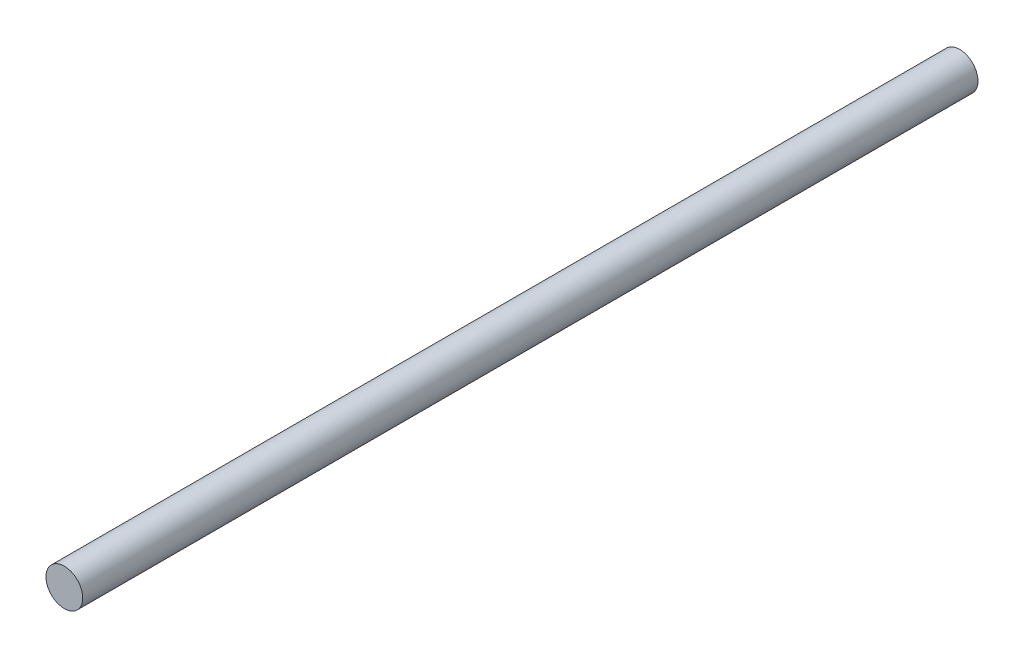
ISO-10303-21;
HEADER;
FILE_DESCRIPTION(('STEP AP214'),'2;1');
FILE_NAME('part.step','',(''),(''),'','','');
FILE_SCHEMA(('AUTOMOTIVE_DESIGN { 1 0 10303 214 1 1 1 1 }'));
ENDSEC;
DATA;
#1=APPLICATION_CONTEXT('core data for automotive mechanical design processes');
#2=APPLICATION_PROTOCOL_DEFINITION('international standard','automotive_design',2000,#1);
#3=PRODUCT_CONTEXT('',#1,'mechanical');
#4=PRODUCT('Part','Part','',(#3));
#5=PRODUCT_RELATED_PRODUCT_CATEGORY('part','',(#4));
#6=PRODUCT_DEFINITION_FORMATION('','',#4);
#7=PRODUCT_DEFINITION_CONTEXT('part definition',#1,'design');
#8=PRODUCT_DEFINITION('design','',#6,#7);
#9=PRODUCT_DEFINITION_SHAPE('','',#8);
#10=(LENGTH_UNIT() NAMED_UNIT(*) SI_UNIT(.MILLI.,.METRE.));
#11=(NAMED_UNIT(*) PLANE_ANGLE_UNIT() SI_UNIT($,.RADIAN.));
#12=(NAMED_UNIT(*) SI_UNIT($,.STERADIAN.) SOLID_ANGLE_UNIT());
#13=UNCERTAINTY_MEASURE_WITH_UNIT(LENGTH_MEASURE(1.E-05),#10,'distance_accuracy_value','');
#14=(GEOMETRIC_REPRESENTATION_CONTEXT(3) GLOBAL_UNCERTAINTY_ASSIGNED_CONTEXT((#13)) GLOBAL_UNIT_ASSIGNED_CONTEXT((#10,
#11,#12)) REPRESENTATION_CONTEXT('',''));
#15=CARTESIAN_POINT('',(0.,0.,0.));
#16=DIRECTION('',(0.,0.,1.));
#17=DIRECTION('',(1.,0.,0.));
#18=AXIS2_PLACEMENT_3D('',#15,#16,#17);
#19=CARTESIAN_POINT('',(0.,0.,73.));
#20=DIRECTION('',(0.,0.,-1.));
#21=DIRECTION('',(-1.,0.,0.));
#22=AXIS2_PLACEMENT_3D('',#19,#20,#21);
#23=CYLINDRICAL_SURFACE('',#22,1.5);
#24=CARTESIAN_POINT('',(0.,0.,73.));
#25=DIRECTION('',(0.,0.,1.));
#26=DIRECTION('',(1.,0.,0.));
#27=AXIS2_PLACEMENT_3D('',#24,#25,#26);
#28=CIRCLE('',#27,1.5);
#29=CARTESIAN_POINT('',(1.5,0.,73.));
#30=VERTEX_POINT('',#29);
#31=EDGE_CURVE('E10',#30,#30,#28,.T.);
#32=ORIENTED_EDGE('',*,*,#31,.F.);
#33=EDGE_LOOP('',(#32));
#34=FACE_BOUND('',#33,.T.);
#35=CARTESIAN_POINT('',(0.,0.,0.));
#36=DIRECTION('',(0.,0.,1.));
#37=DIRECTION('',(1.,0.,0.));
#38=AXIS2_PLACEMENT_3D('',#35,#36,#37);
#39=CIRCLE('',#38,1.5);
#40=CARTESIAN_POINT('',(1.5,0.,0.));
#41=VERTEX_POINT('',#40);
#42=EDGE_CURVE('E33',#41,#41,#39,.T.);
#43=ORIENTED_EDGE('',*,*,#42,.T.);
#44=EDGE_LOOP('',(#43));
#45=FACE_BOUND('',#44,.T.);
#46=ADVANCED_FACE('F30',(#34,#45),#23,.T.);
#47=CARTESIAN_POINT('',(0.,0.,73.));
#48=DIRECTION('',(0.,0.,1.));
#49=DIRECTION('',(1.,0.,0.));
#50=AXIS2_PLACEMENT_3D('',#47,#48,#49);
#51=PLANE('',#50);
#52=ORIENTED_EDGE('',*,*,#31,.T.);
#53=EDGE_LOOP('',(#52));
#54=FACE_BOUND('',#53,.T.);
#55=ADVANCED_FACE('F45',(#54),#51,.T.);
#56=CARTESIAN_POINT('',(0.,0.,0.));
#57=DIRECTION('',(0.,0.,1.));
#58=DIRECTION('',(1.,0.,0.));
#59=AXIS2_PLACEMENT_3D('',#56,#57,#58);
#60=PLANE('',#59);
#61=ORIENTED_EDGE('',*,*,#42,.F.);
#62=EDGE_LOOP('',(#61));
#63=FACE_BOUND('',#62,.T.);
#64=ADVANCED_FACE('F43',(#63),#60,.F.);
#65=CLOSED_SHELL('',(#46,#55,#64));
#66=MANIFOLD_SOLID_BREP('B2',#65);
#67=ADVANCED_BREP_SHAPE_REPRESENTATION('',(#18,#66),#14);
#68=SHAPE_DEFINITION_REPRESENTATION(#9,#67);
ENDSEC;
END-ISO-10303-21;
